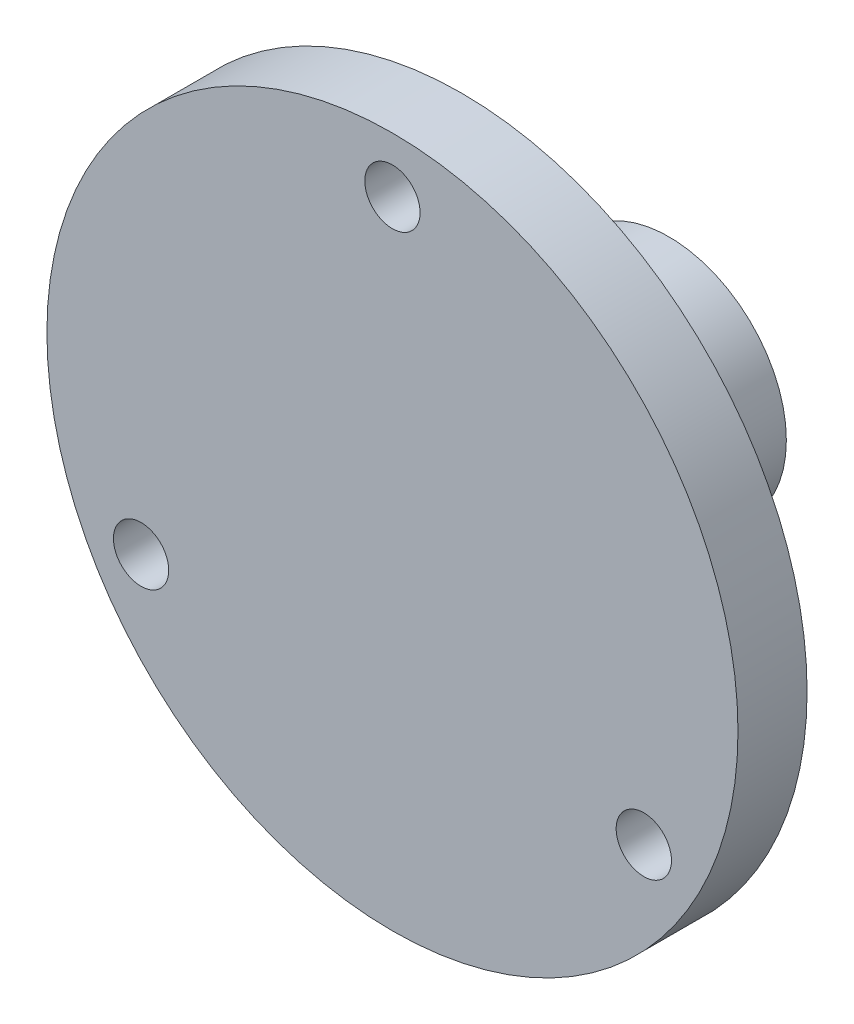
ISO-10303-21;
HEADER;
FILE_DESCRIPTION(('STEP AP214'),'2;1');
FILE_NAME('part.step','',(''),(''),'','','');
FILE_SCHEMA(('AUTOMOTIVE_DESIGN { 1 0 10303 214 1 1 1 1 }'));
ENDSEC;
DATA;
#1=APPLICATION_CONTEXT('core data for automotive mechanical design processes');
#2=APPLICATION_PROTOCOL_DEFINITION('international standard','automotive_design',2000,#1);
#3=PRODUCT_CONTEXT('',#1,'mechanical');
#4=PRODUCT('Part','Part','',(#3));
#5=PRODUCT_RELATED_PRODUCT_CATEGORY('part','',(#4));
#6=PRODUCT_DEFINITION_FORMATION('','',#4);
#7=PRODUCT_DEFINITION_CONTEXT('part definition',#1,'design');
#8=PRODUCT_DEFINITION('design','',#6,#7);
#9=PRODUCT_DEFINITION_SHAPE('','',#8);
#10=(LENGTH_UNIT() NAMED_UNIT(*) SI_UNIT(.MILLI.,.METRE.));
#11=(NAMED_UNIT(*) PLANE_ANGLE_UNIT() SI_UNIT($,.RADIAN.));
#12=(NAMED_UNIT(*) SI_UNIT($,.STERADIAN.) SOLID_ANGLE_UNIT());
#13=UNCERTAINTY_MEASURE_WITH_UNIT(LENGTH_MEASURE(1.E-05),#10,'distance_accuracy_value','');
#14=(GEOMETRIC_REPRESENTATION_CONTEXT(3) GLOBAL_UNCERTAINTY_ASSIGNED_CONTEXT((#13)) GLOBAL_UNIT_ASSIGNED_CONTEXT((#10,
#11,#12)) REPRESENTATION_CONTEXT('',''));
#15=CARTESIAN_POINT('',(0.,0.,0.));
#16=DIRECTION('',(0.,0.,1.));
#17=DIRECTION('',(1.,0.,0.));
#18=AXIS2_PLACEMENT_3D('',#15,#16,#17);
#19=CARTESIAN_POINT('',(0.,0.,0.));
#20=DIRECTION('',(0.,0.,1.));
#21=DIRECTION('',(1.,0.,0.));
#22=AXIS2_PLACEMENT_3D('',#19,#20,#21);
#23=CYLINDRICAL_SURFACE('',#22,12.7);
#24=CARTESIAN_POINT('',(0.,-12.7,-34.25));
#25=CARTESIAN_POINT('',(-0.231842485477689,-12.7000007830132,-34.2500012612385));
#26=CARTESIAN_POINT('',(-0.463676995619259,-12.6935930237934,-34.23096743451));
#27=CARTESIAN_POINT('',(-0.920514309419077,-12.6686626811236,-34.1555702559658));
#28=CARTESIAN_POINT('',(-1.14551645494716,-12.6501389344458,-34.0992033198781));
#29=CARTESIAN_POINT('',(-1.58203696952573,-12.6029886397923,-33.9512906027172));
#30=CARTESIAN_POINT('',(-1.79357729332375,-12.5743790665333,-33.8598039062806));
#31=CARTESIAN_POINT('',(-2.1983110147476,-12.5099751759744,-33.6445166990585));
#32=CARTESIAN_POINT('',(-2.39150073812595,-12.474179424271,-33.5207097354728));
#33=CARTESIAN_POINT('',(-2.76078654880293,-12.3977720837665,-33.2397626793203));
#34=CARTESIAN_POINT('',(-2.93615439481415,-12.3570444809732,-33.0816971002867));
#35=CARTESIAN_POINT('',(-3.25845012848092,-12.2759998868099,-32.7386873206566));
#36=CARTESIAN_POINT('',(-3.40537168699156,-12.2356829887054,-32.5537371543743));
#37=CARTESIAN_POINT('',(-3.67077525511996,-12.158745947934,-32.1556354026522));
#38=CARTESIAN_POINT('',(-3.78830816203193,-12.1222670474646,-31.9418211435214));
#39=CARTESIAN_POINT('',(-3.98543540896977,-12.0589014712391,-31.4960431529153));
#40=CARTESIAN_POINT('',(-4.06504143092195,-12.0320118425172,-31.2640850356218));
#41=CARTESIAN_POINT('',(-4.18131890368397,-11.9920915344925,-30.7968882173133));
#42=CARTESIAN_POINT('',(-4.21935573225782,-11.9786214962095,-30.5620279957362));
#43=CARTESIAN_POINT('',(-4.25568347252199,-11.9657663735035,-30.0889024928102));
#44=CARTESIAN_POINT('',(-4.25398678125709,-11.9663768958786,-29.8506382967039));
#45=CARTESIAN_POINT('',(-4.21195528947811,-11.9812290680516,-29.3891374770404));
#46=CARTESIAN_POINT('',(-4.17340554987952,-11.9948409413268,-29.1657144864736));
#47=CARTESIAN_POINT('',(-4.06167545132787,-12.0331311099076,-28.7287117420694));
#48=CARTESIAN_POINT('',(-3.98849091546046,-12.0578107399525,-28.5151331788681));
#49=CARTESIAN_POINT('',(-3.80840594130702,-12.1159022567189,-28.0998390301114));
#50=CARTESIAN_POINT('',(-3.70097860568121,-12.1494491053556,-27.8983716201879));
#51=CARTESIAN_POINT('',(-3.45582331327757,-12.2214389842504,-27.5157602710478));
#52=CARTESIAN_POINT('',(-3.31808654903209,-12.2598834363088,-27.3346222624024));
#53=CARTESIAN_POINT('',(-3.00766124206506,-12.3398112142789,-26.987785302604));
#54=CARTESIAN_POINT('',(-2.83351437105054,-12.381347971637,-26.8234012125245));
#55=CARTESIAN_POINT('',(-2.45961521549961,-12.4610105953748,-26.5258259616716));
#56=CARTESIAN_POINT('',(-2.25986043921874,-12.4991361292159,-26.3926378399522));
#57=CARTESIAN_POINT('',(-1.83761025749114,-12.5681879637238,-26.1601654270006));
#58=CARTESIAN_POINT('',(-1.6149061537069,-12.5990379205903,-26.0612359678836));
#59=CARTESIAN_POINT('',(-1.15473721743719,-12.649508090629,-25.9026533041889));
#60=CARTESIAN_POINT('',(-0.917277586558132,-12.6691322364961,-25.8429863438297));
#61=CARTESIAN_POINT('',(-0.445467513972475,-12.6942870000793,-25.7669577295333));
#62=CARTESIAN_POINT('',(-0.211433771574517,-12.7003953946827,-25.7488195308219));
#63=CARTESIAN_POINT('',(0.256381520779651,-12.6995648357979,-25.7512993107811));
#64=CARTESIAN_POINT('',(0.490163106899585,-12.6926281043092,-25.7719106891673));
#65=CARTESIAN_POINT('',(0.943710616119393,-12.6668680990626,-25.8499003074258));
#66=CARTESIAN_POINT('',(1.16368647866887,-12.6483983000775,-25.906185919068));
#67=CARTESIAN_POINT('',(1.59098248280005,-12.6017858364619,-26.0525580274301));
#68=CARTESIAN_POINT('',(1.79830100416235,-12.5736419365299,-26.1426488409251));
#69=CARTESIAN_POINT('',(2.2005032030246,-12.5096113397672,-26.3567111434203));
#70=CARTESIAN_POINT('',(2.39491369659754,-12.4735397382247,-26.4815148048116));
#71=CARTESIAN_POINT('',(2.76060901281045,-12.3977405993665,-26.7604835961703));
#72=CARTESIAN_POINT('',(2.9318866957179,-12.3580119396659,-26.914657755846));
#73=CARTESIAN_POINT('',(3.25462225547432,-12.2770680388917,-27.2563443551907));
#74=CARTESIAN_POINT('',(3.4048125874238,-12.2358680802768,-27.4450605669338));
#75=CARTESIAN_POINT('',(3.67155276243923,-12.1584971182436,-27.8458998882039));
#76=CARTESIAN_POINT('',(3.78810226272241,-12.1223261660702,-28.0580232362071));
#77=CARTESIAN_POINT('',(3.98372707837644,-12.0594576491274,-28.4997871990218));
#78=CARTESIAN_POINT('',(4.06287286907747,-12.0327422923622,-28.7293939160983));
#79=CARTESIAN_POINT('',(4.18101409065173,-11.99220989748,-29.1997782668773));
#80=CARTESIAN_POINT('',(4.22002779834845,-11.9783869881942,-29.4405507632381));
#81=CARTESIAN_POINT('',(4.2553652030169,-11.965875716158,-29.9130209174441));
#82=CARTESIAN_POINT('',(4.25379442249757,-11.9664408771634,-30.1445430681297));
#83=CARTESIAN_POINT('',(4.21319571568979,-11.9807944121373,-30.6038405238481));
#84=CARTESIAN_POINT('',(4.1741700524378,-11.9945819872031,-30.8316160544071));
#85=CARTESIAN_POINT('',(4.06126464747471,-12.0332689163471,-31.2725782638138));
#86=CARTESIAN_POINT('',(3.98807198081187,-12.0579487238983,-31.4859616402185));
#87=CARTESIAN_POINT('',(3.8094682451443,-12.1155567404975,-31.897581833261));
#88=CARTESIAN_POINT('',(3.70404998927837,-12.1484867891955,-32.0958152588593));
#89=CARTESIAN_POINT('',(3.45858592105688,-12.2206878565681,-32.4809459433433));
#90=CARTESIAN_POINT('',(3.31722264117411,-12.260173846087,-32.6669629621793));
#91=CARTESIAN_POINT('',(3.00610284853705,-12.3401423049604,-33.0133147391809));
#92=CARTESIAN_POINT('',(2.83633827843291,-12.3806250543048,-33.1736421839602));
#93=CARTESIAN_POINT('',(2.46520423896725,-12.4599404755415,-33.4704325719266));
#94=CARTESIAN_POINT('',(2.26285309599365,-12.498645296872,-33.6057064152756));
#95=CARTESIAN_POINT('',(1.83700682078668,-12.5682880759689,-33.8401749080672));
#96=CARTESIAN_POINT('',(1.61351691548857,-12.5992279468806,-33.9393784472981));
#97=CARTESIAN_POINT('',(1.16139505097975,-12.648741489848,-34.0949211206583));
#98=CARTESIAN_POINT('',(0.93337515749296,-12.6677807245626,-34.1528882525832));
#99=CARTESIAN_POINT('',(0.470232762281187,-12.6934078289513,-34.2304216443052));
#100=CARTESIAN_POINT('',(0.235112280199051,-12.6999992059435,-34.2499987209736));
#101=CARTESIAN_POINT('',(0.,-12.7,-34.25));
#102=B_SPLINE_CURVE_WITH_KNOTS('',3,(#24,#25,#26,#27,#28,#29,#30,#31,#32,#33,#34,#35,#36,#37,
#38,#39,#40,#41,#42,#43,#44,#45,#46,#47,#48,#49,#50,#51,#52,#53,#54,#55,#56,#57,#58,#59,#60,#61,
#62,#63,#64,#65,#66,#67,#68,#69,#70,#71,#72,#73,#74,#75,#76,#77,#78,#79,#80,#81,#82,#83,#84,#85,
#86,#87,#88,#89,#90,#91,#92,#93,#94,#95,#96,#97,#98,#99,#100,#101),.UNSPECIFIED.,.T.,.F.,(4,2,2,
2,2,2,2,2,2,2,2,2,2,2,2,2,2,2,2,2,2,2,2,2,2,2,2,2,2,2,2,2,2,2,2,2,2,2,4),(0.,0.69466219644897,
1.38939109559831,2.08295628599035,2.77666005397789,3.49217041485631,4.20783979043205,
4.94427896532909,5.68049116142398,6.39171869942388,7.10272433404949,7.78094824233089,
8.45925396444277,9.14854621093634,9.83803902059198,10.5638311505952,11.2896939565531,
12.0228645069128,12.7557780509269,13.4567008238895,14.1575042182453,14.8378171745532,
15.518217033405,16.2165914165274,16.9151808563973,17.6457758998408,18.3763783874091,
19.1055987451217,19.8344868564301,20.5256400044818,21.2167513954595,21.894527099023,
22.5724540686485,23.2801548831202,23.9880568114394,24.72384915567,25.4594600354206,
26.1641179874323,26.8685773648354),.UNSPECIFIED.);
#103=CARTESIAN_POINT('',(0.,-12.7,-34.25));
#104=VERTEX_POINT('',#103);
#105=EDGE_CURVE('E287',#104,#104,#102,.T.);
#106=ORIENTED_EDGE('',*,*,#105,.F.);
#107=EDGE_LOOP('',(#106));
#108=FACE_BOUND('',#107,.T.);
#109=CARTESIAN_POINT('',(0.,12.7,-25.75));
#110=CARTESIAN_POINT('',(0.231842485477689,12.7000007830132,-25.7499987387615));
#111=CARTESIAN_POINT('',(0.463676995619259,12.6935930237934,-25.76903256549));
#112=CARTESIAN_POINT('',(0.920514309419077,12.6686626811236,-25.8444297440342));
#113=CARTESIAN_POINT('',(1.14551645494715,12.6501389344458,-25.9007966801219));
#114=CARTESIAN_POINT('',(1.58203696952573,12.6029886397923,-26.0487093972829));
#115=CARTESIAN_POINT('',(1.79357729332375,12.5743790665333,-26.1401960937194));
#116=CARTESIAN_POINT('',(2.19831101474759,12.5099751759744,-26.3554833009415));
#117=CARTESIAN_POINT('',(2.39150073812595,12.474179424271,-26.4792902645272));
#118=CARTESIAN_POINT('',(2.76078654880293,12.3977720837665,-26.7602373206797));
#119=CARTESIAN_POINT('',(2.93615439481415,12.3570444809732,-26.9183028997133));
#120=CARTESIAN_POINT('',(3.25845012848092,12.2759998868099,-27.2613126793434));
#121=CARTESIAN_POINT('',(3.40537168699155,12.2356829887054,-27.4462628456257));
#122=CARTESIAN_POINT('',(3.67077525511996,12.158745947934,-27.8443645973478));
#123=CARTESIAN_POINT('',(3.78830816203193,12.1222670474646,-28.0581788564786));
#124=CARTESIAN_POINT('',(3.98543540896977,12.0589014712391,-28.5039568470847));
#125=CARTESIAN_POINT('',(4.06504143092194,12.0320118425172,-28.7359149643782));
#126=CARTESIAN_POINT('',(4.18131890368397,11.9920915344925,-29.2031117826867));
#127=CARTESIAN_POINT('',(4.21935573225782,11.9786214962095,-29.4379720042638));
#128=CARTESIAN_POINT('',(4.25568347252199,11.9657663735035,-29.9110975071898));
#129=CARTESIAN_POINT('',(4.25398678125709,11.9663768958786,-30.1493617032961));
#130=CARTESIAN_POINT('',(4.21195528947811,11.9812290680516,-30.6108625229596));
#131=CARTESIAN_POINT('',(4.17340554987952,11.9948409413268,-30.8342855135263));
#132=CARTESIAN_POINT('',(4.06167545132787,12.0331311099076,-31.2712882579306));
#133=CARTESIAN_POINT('',(3.98849091546046,12.0578107399525,-31.4848668211319));
#134=CARTESIAN_POINT('',(3.80840594130702,12.1159022567189,-31.9001609698886));
#135=CARTESIAN_POINT('',(3.70097860568121,12.1494491053557,-32.1016283798121));
#136=CARTESIAN_POINT('',(3.45582331327757,12.2214389842504,-32.4842397289522));
#137=CARTESIAN_POINT('',(3.31808654903209,12.2598834363088,-32.6653777375976));
#138=CARTESIAN_POINT('',(3.00766124206506,12.3398112142789,-33.012214697396));
#139=CARTESIAN_POINT('',(2.83351437105054,12.381347971637,-33.1765987874755));
#140=CARTESIAN_POINT('',(2.45961521549961,12.4610105953748,-33.4741740383284));
#141=CARTESIAN_POINT('',(2.25986043921874,12.4991361292159,-33.6073621600478));
#142=CARTESIAN_POINT('',(1.83761025749114,12.5681879637238,-33.8398345729994));
#143=CARTESIAN_POINT('',(1.6149061537069,12.5990379205903,-33.9387640321164));
#144=CARTESIAN_POINT('',(1.15473721743719,12.649508090629,-34.0973466958111));
#145=CARTESIAN_POINT('',(0.917277586558134,12.6691322364961,-34.1570136561703));
#146=CARTESIAN_POINT('',(0.445467513972477,12.6942870000793,-34.2330422704666));
#147=CARTESIAN_POINT('',(0.211433771574518,12.7003953946827,-34.2511804691781));
#148=CARTESIAN_POINT('',(-0.256381520779649,12.6995648357979,-34.2487006892189));
#149=CARTESIAN_POINT('',(-0.490163106899583,12.6926281043092,-34.2280893108327));
#150=CARTESIAN_POINT('',(-0.943710616119391,12.6668680990626,-34.1500996925742));
#151=CARTESIAN_POINT('',(-1.16368647866886,12.6483983000775,-34.093814080932));
#152=CARTESIAN_POINT('',(-1.59098248280005,12.6017858364619,-33.9474419725699));
#153=CARTESIAN_POINT('',(-1.79830100416234,12.5736419365299,-33.8573511590749));
#154=CARTESIAN_POINT('',(-2.2005032030246,12.5096113397672,-33.6432888565797));
#155=CARTESIAN_POINT('',(-2.39491369659754,12.4735397382247,-33.5184851951884));
#156=CARTESIAN_POINT('',(-2.76060901281045,12.3977405993665,-33.2395164038297));
#157=CARTESIAN_POINT('',(-2.9318866957179,12.3580119396659,-33.085342244154));
#158=CARTESIAN_POINT('',(-3.25462225547432,12.2770680388917,-32.7436556448093));
#159=CARTESIAN_POINT('',(-3.4048125874238,12.2358680802768,-32.5549394330662));
#160=CARTESIAN_POINT('',(-3.67155276243922,12.1584971182436,-32.1541001117961));
#161=CARTESIAN_POINT('',(-3.7881022627224,12.1223261660702,-31.9419767637929));
#162=CARTESIAN_POINT('',(-3.98372707837644,12.0594576491274,-31.5002128009782));
#163=CARTESIAN_POINT('',(-4.06287286907747,12.0327422923622,-31.2706060839018));
#164=CARTESIAN_POINT('',(-4.18101409065172,11.99220989748,-30.8002217331227));
#165=CARTESIAN_POINT('',(-4.22002779834845,11.9783869881942,-30.5594492367619));
#166=CARTESIAN_POINT('',(-4.2553652030169,11.965875716158,-30.0869790825559));
#167=CARTESIAN_POINT('',(-4.25379442249757,11.9664408771634,-29.8554569318703));
#168=CARTESIAN_POINT('',(-4.21319571568979,11.9807944121373,-29.3961594761519));
#169=CARTESIAN_POINT('',(-4.1741700524378,11.9945819872031,-29.1683839455929));
#170=CARTESIAN_POINT('',(-4.0612646474747,12.0332689163471,-28.7274217361862));
#171=CARTESIAN_POINT('',(-3.98807198081187,12.0579487238983,-28.5140383597815));
#172=CARTESIAN_POINT('',(-3.8094682451443,12.1155567404975,-28.102418166739));
#173=CARTESIAN_POINT('',(-3.70404998927837,12.1484867891955,-27.9041847411407));
#174=CARTESIAN_POINT('',(-3.45858592105688,12.2206878565681,-27.5190540566567));
#175=CARTESIAN_POINT('',(-3.31722264117411,12.260173846087,-27.3330370378207));
#176=CARTESIAN_POINT('',(-3.00610284853705,12.3401423049603,-26.9866852608191));
#177=CARTESIAN_POINT('',(-2.83633827843291,12.3806250543048,-26.8263578160398));
#178=CARTESIAN_POINT('',(-2.46520423896725,12.4599404755415,-26.5295674280735));
#179=CARTESIAN_POINT('',(-2.26285309599365,12.4986452968721,-26.3942935847244));
#180=CARTESIAN_POINT('',(-1.83700682078667,12.5682880759689,-26.1598250919328));
#181=CARTESIAN_POINT('',(-1.61351691548857,12.5992279468806,-26.0606215527019));
#182=CARTESIAN_POINT('',(-1.16139505097975,12.648741489848,-25.9050788793417));
#183=CARTESIAN_POINT('',(-0.933375157492959,12.6677807245626,-25.8471117474168));
#184=CARTESIAN_POINT('',(-0.470232762281187,12.6934078289513,-25.7695783556948));
#185=CARTESIAN_POINT('',(-0.235112280199051,12.6999992059435,-25.7500012790264));
#186=CARTESIAN_POINT('',(0.,12.7,-25.75));
#187=B_SPLINE_CURVE_WITH_KNOTS('',3,(#109,#110,#111,#112,#113,#114,#115,#116,#117,#118,#119,
#120,#121,#122,#123,#124,#125,#126,#127,#128,#129,#130,#131,#132,#133,#134,#135,#136,#137,#138,
#139,#140,#141,#142,#143,#144,#145,#146,#147,#148,#149,#150,#151,#152,#153,#154,#155,#156,#157,
#158,#159,#160,#161,#162,#163,#164,#165,#166,#167,#168,#169,#170,#171,#172,#173,#174,#175,#176,
#177,#178,#179,#180,#181,#182,#183,#184,#185,#186),.UNSPECIFIED.,.T.,.F.,(4,2,2,2,2,2,2,2,2,2,2,
2,2,2,2,2,2,2,2,2,2,2,2,2,2,2,2,2,2,2,2,2,2,2,2,2,2,2,4),(0.,0.69466219644897,1.38939109559831,
2.08295628599035,2.77666005397788,3.49217041485631,4.20783979043204,4.94427896532908,
5.68049116142398,6.39171869942387,7.10272433404949,7.78094824233088,8.45925396444277,
9.14854621093634,9.83803902059197,10.5638311505952,11.2896939565531,12.0228645069127,
12.7557780509269,13.4567008238895,14.1575042182452,14.8378171745532,15.518217033405,
16.2165914165274,16.9151808563973,17.6457758998408,18.3763783874091,19.1055987451217,
19.8344868564301,20.5256400044818,21.2167513954595,21.894527099023,22.5724540686484,
23.2801548831202,23.9880568114394,24.72384915567,25.4594600354206,26.1641179874323,
26.8685773648354),.UNSPECIFIED.);
#188=CARTESIAN_POINT('',(0.,12.7,-25.75));
#189=VERTEX_POINT('',#188);
#190=EDGE_CURVE('E82',#189,#189,#187,.T.);
#191=ORIENTED_EDGE('',*,*,#190,.T.);
#192=EDGE_LOOP('',(#191));
#193=FACE_BOUND('',#192,.T.);
#194=CARTESIAN_POINT('',(0.,0.,-40.));
#195=DIRECTION('',(0.,0.,1.));
#196=DIRECTION('',(1.,0.,0.));
#197=AXIS2_PLACEMENT_3D('',#194,#195,#196);
#198=CIRCLE('',#197,12.7);
#199=CARTESIAN_POINT('',(12.7,0.,-40.));
#200=VERTEX_POINT('',#199);
#201=EDGE_CURVE('E50',#200,#200,#198,.T.);
#202=ORIENTED_EDGE('',*,*,#201,.F.);
#203=EDGE_LOOP('',(#202));
#204=FACE_BOUND('',#203,.T.);
#205=CARTESIAN_POINT('',(0.,0.,-20.));
#206=DIRECTION('',(0.,0.,1.));
#207=DIRECTION('',(1.,0.,0.));
#208=AXIS2_PLACEMENT_3D('',#205,#206,#207);
#209=CIRCLE('',#208,12.7);
#210=CARTESIAN_POINT('',(12.7,0.,-20.));
#211=VERTEX_POINT('',#210);
#212=EDGE_CURVE('E99',#211,#211,#209,.T.);
#213=ORIENTED_EDGE('',*,*,#212,.T.);
#214=EDGE_LOOP('',(#213));
#215=FACE_BOUND('',#214,.T.);
#216=ADVANCED_FACE('F35',(#108,#193,#204,#215),#23,.F.);
#217=CARTESIAN_POINT('',(0.,17.,-40.));
#218=DIRECTION('',(0.,0.,1.));
#219=DIRECTION('',(1.,0.,0.));
#220=AXIS2_PLACEMENT_3D('',#217,#218,#219);
#221=PLANE('',#220);
#222=CARTESIAN_POINT('',(0.,0.,-40.));
#223=DIRECTION('',(0.,0.,1.));
#224=DIRECTION('',(1.,0.,0.));
#225=AXIS2_PLACEMENT_3D('',#222,#223,#224);
#226=CIRCLE('',#225,17.);
#227=CARTESIAN_POINT('',(17.,0.,-40.));
#228=VERTEX_POINT('',#227);
#229=EDGE_CURVE('E54',#228,#228,#226,.T.);
#230=ORIENTED_EDGE('',*,*,#229,.F.);
#231=EDGE_LOOP('',(#230));
#232=FACE_BOUND('',#231,.T.);
#233=ORIENTED_EDGE('',*,*,#201,.T.);
#234=EDGE_LOOP('',(#233));
#235=FACE_BOUND('',#234,.T.);
#236=ADVANCED_FACE('F124',(#232,#235),#221,.F.);
#237=CARTESIAN_POINT('',(0.,0.,0.));
#238=DIRECTION('',(0.,0.,1.));
#239=DIRECTION('',(1.,0.,0.));
#240=AXIS2_PLACEMENT_3D('',#237,#238,#239);
#241=CYLINDRICAL_SURFACE('',#240,17.);
#242=CARTESIAN_POINT('',(-3.27361521331593,-16.6818297407233,-33.3819653485074));
#243=CARTESIAN_POINT('',(-3.45424515670908,-16.6463856388575,-33.1577761453749));
#244=CARTESIAN_POINT('',(-3.61529982943289,-16.6117477568102,-32.9173914968345));
#245=CARTESIAN_POINT('',(-3.89577563186445,-16.5482242845638,-32.4124613246661));
#246=CARTESIAN_POINT('',(-4.01511916319783,-16.5193494581494,-32.1478719122983));
#247=CARTESIAN_POINT('',(-4.21076205806757,-16.4705714056275,-31.6011343855303));
#248=CARTESIAN_POINT('',(-4.28687180407884,-16.4507077768683,-31.3189148569379));
#249=CARTESIAN_POINT('',(-4.39409913783549,-16.4223928298015,-30.745659661486));
#250=CARTESIAN_POINT('',(-4.42523542296754,-16.4139367689779,-30.454627709735));
#251=CARTESIAN_POINT('',(-4.44246539399084,-16.4092849869825,-29.8585809934337));
#252=CARTESIAN_POINT('',(-4.42656799878592,-16.4136311916488,-29.5535023185141));
#253=CARTESIAN_POINT('',(-4.34562804421359,-16.4352436225869,-28.9503193600313));
#254=CARTESIAN_POINT('',(-4.28057164209882,-16.4525134880357,-28.6522170653368));
#255=CARTESIAN_POINT('',(-4.10209152539875,-16.497918346404,-28.0707824357088));
#256=CARTESIAN_POINT('',(-3.98853490621438,-16.5260831745208,-27.7874931046813));
#257=CARTESIAN_POINT('',(-3.71465855288783,-16.5897862919048,-27.2452165262402));
#258=CARTESIAN_POINT('',(-3.55433212535928,-16.6253256363539,-26.986232764296));
#259=CARTESIAN_POINT('',(-3.1948472143184,-16.6980687507052,-26.5092164808346));
#260=CARTESIAN_POINT('',(-2.9970035171134,-16.7351901687246,-26.290185611107));
#261=CARTESIAN_POINT('',(-2.56309114611482,-16.8071017584507,-25.8933310356796));
#262=CARTESIAN_POINT('',(-2.32705414646122,-16.841893828398,-25.7154734790396));
#263=CARTESIAN_POINT('',(-1.84930715552841,-16.9006420543721,-25.4271736445768));
#264=CARTESIAN_POINT('',(-1.61079118552331,-16.9253521461019,-25.3116157938424));
#265=CARTESIAN_POINT('',(-1.11518971580867,-16.9651926869773,-25.1289145413224));
#266=CARTESIAN_POINT('',(-0.858130127932396,-16.9803362256842,-25.0617049688161));
#267=CARTESIAN_POINT('',(-0.37213341367953,-16.9974175136064,-24.9862277557885));
#268=CARTESIAN_POINT('',(-0.144313477046666,-17.0009105152486,-24.9710109842641));
#269=CARTESIAN_POINT('',(0.310387414733713,-16.9986838868057,-24.980766927575));
#270=CARTESIAN_POINT('',(0.537268652214914,-16.9929672647661,-25.0057265200118));
#271=CARTESIAN_POINT('',(0.969166714411751,-16.9736460903541,-25.0915778100138));
#272=CARTESIAN_POINT('',(1.1746713782833,-16.9605464049786,-25.150173734802));
#273=CARTESIAN_POINT('',(1.57350937399138,-16.928205454198,-25.2985807403268));
#274=CARTESIAN_POINT('',(1.76684080175568,-16.9089632308529,-25.388396690077));
#275=CARTESIAN_POINT('',(2.14812867894102,-16.8648895736323,-25.6015397705134));
#276=CARTESIAN_POINT('',(2.33514247961429,-16.8398010681658,-25.7264921151662));
#277=CARTESIAN_POINT('',(2.68822121831947,-16.7870604746278,-26.0026272471636));
#278=CARTESIAN_POINT('',(2.85427688602294,-16.7594072614361,-26.1538215722772));
#279=CARTESIAN_POINT('',(3.18270908541578,-16.7003475738776,-26.4983215608598));
#280=CARTESIAN_POINT('',(3.3420350775809,-16.6689037456891,-26.6945283499281));
#281=CARTESIAN_POINT('',(3.62968252062306,-16.6086435462679,-27.1088360886797));
#282=CARTESIAN_POINT('',(3.75798829875736,-16.5798285077711,-27.3269480273451));
#283=CARTESIAN_POINT('',(3.99565017625497,-16.5242693768213,-27.8068951020232));
#284=CARTESIAN_POINT('',(4.10091229720172,-16.4981837524708,-28.0708409318554));
#285=CARTESIAN_POINT('',(4.26949883488415,-16.4553626045415,-28.6125245526601));
#286=CARTESIAN_POINT('',(4.33281105988943,-16.438629799356,-28.8902663279048));
#287=CARTESIAN_POINT('',(4.41916573033342,-16.4156380952927,-29.4698608826249));
#288=CARTESIAN_POINT('',(4.43950402748566,-16.4100835245962,-29.772148473907));
#289=CARTESIAN_POINT('',(4.43156865210878,-16.4122270203369,-30.3760538503075));
#290=CARTESIAN_POINT('',(4.40328863399599,-16.4199268167127,-30.6776715428471));
#291=CARTESIAN_POINT('',(4.29792611030869,-16.4478212362834,-31.2755581805742));
#292=CARTESIAN_POINT('',(4.22024375320951,-16.4681693681561,-31.5717146780705));
#293=CARTESIAN_POINT('',(4.01670973870633,-16.5189886963301,-32.1461910588415));
#294=CARTESIAN_POINT('',(3.89084834202122,-16.5494619392347,-32.4245073224655));
#295=CARTESIAN_POINT('',(3.59481410747006,-16.6162562554145,-32.9508377836111));
#296=CARTESIAN_POINT('',(3.42525976581041,-16.6524931992147,-33.199209070805));
#297=CARTESIAN_POINT('',(3.0435908626901,-16.7264518359978,-33.6607454536144));
#298=CARTESIAN_POINT('',(2.83148945792657,-16.7641730671076,-33.8739213955198));
#299=CARTESIAN_POINT('',(2.38624889069173,-16.8330816203755,-34.2405851265246));
#300=CARTESIAN_POINT('',(2.15585661417556,-16.8645463973074,-34.3973377530233));
#301=CARTESIAN_POINT('',(1.66815290966798,-16.9197243862393,-34.6630062627042));
#302=CARTESIAN_POINT('',(1.41088099242804,-16.9434487700717,-34.7719911685688));
#303=CARTESIAN_POINT('',(0.915839780950349,-16.9768656775972,-34.9231117424344));
#304=CARTESIAN_POINT('',(0.680368167260679,-16.9880556223017,-34.9724601617445));
#305=CARTESIAN_POINT('',(0.204151600893952,-17.0004369165186,-35.0269876929835));
#306=CARTESIAN_POINT('',(-0.0365893331505099,-17.0016356365205,-35.0321993644732));
#307=CARTESIAN_POINT('',(-0.490201134685676,-16.9942913171326,-34.9999349603376));
#308=CARTESIAN_POINT('',(-0.703410203239341,-16.9867294107404,-34.9667585717315));
#309=CARTESIAN_POINT('',(-1.12125631307373,-16.9642734037876,-34.866381791226));
#310=CARTESIAN_POINT('',(-1.32589156325056,-16.9493777793904,-34.7991743280971));
#311=CARTESIAN_POINT('',(-1.72485586285969,-16.9134772837977,-34.6325619341514));
#312=CARTESIAN_POINT('',(-1.91896309656279,-16.8923769700726,-34.5326510044557));
#313=CARTESIAN_POINT('',(-2.28942227739166,-16.84616912408,-34.3050595132082));
#314=CARTESIAN_POINT('',(-2.46578196082821,-16.8210633502745,-34.1773911287482));
#315=CARTESIAN_POINT('',(-2.74941304473098,-16.776617370256,-33.9394714683443));
#316=CARTESIAN_POINT('',(-2.86177200443256,-16.757747072841,-33.8351022903775));
#317=CARTESIAN_POINT('',(-3.0758072694621,-16.7197849806031,-33.6160063114654));
#318=CARTESIAN_POINT('',(-3.17748348740223,-16.7006931839698,-33.5012794258055));
#319=CARTESIAN_POINT('',(-3.27361521331593,-16.6818297407233,-33.3819653485074));
#320=B_SPLINE_CURVE_WITH_KNOTS('',3,(#242,#243,#244,#245,#246,#247,#248,#249,#250,#251,#252,
#253,#254,#255,#256,#257,#258,#259,#260,#261,#262,#263,#264,#265,#266,#267,#268,#269,#270,#271,
#272,#273,#274,#275,#276,#277,#278,#279,#280,#281,#282,#283,#284,#285,#286,#287,#288,#289,#290,
#291,#292,#293,#294,#295,#296,#297,#298,#299,#300,#301,#302,#303,#304,#305,#306,#307,#308,#309,
#310,#311,#312,#313,#314,#315,#316,#317,#318,#319),.UNSPECIFIED.,.T.,.F.,(4,2,2,2,2,2,2,2,2,2,2,
2,2,2,2,2,2,2,2,2,2,2,2,2,2,2,2,2,2,2,2,2,2,2,2,2,2,2,4),(0.,0.869655525326563,1.74092043048219,
2.61597765271419,3.49067097150527,4.40291521556946,5.31541643542389,6.23043437939201,
7.14558333898819,8.03317340330766,8.92003111656327,9.71383221655853,10.5065448218436,
11.1879896651553,11.8692119802055,12.5086868226607,13.1482614411323,13.8244813468435,
14.50099932171,15.2620225610422,16.023429502176,16.8757824135366,17.7283829322864,
18.6332070883353,19.5381493495319,20.4542950038029,21.3706259526762,22.2746372706741,
23.1783694737742,24.0147331671827,24.8498843278083,25.5683448620608,26.2862753436908,
26.9309810721491,27.5758208173612,28.2311507464363,28.8861937627289,29.3490229105698,
29.8118558441885),.UNSPECIFIED.);
#321=CARTESIAN_POINT('',(-3.27361521331593,-16.6818297407233,-33.3819653485074));
#322=VERTEX_POINT('',#321);
#323=EDGE_CURVE('E10',#322,#322,#320,.T.);
#324=ORIENTED_EDGE('',*,*,#323,.T.);
#325=EDGE_LOOP('',(#324));
#326=FACE_BOUND('',#325,.T.);
#327=CARTESIAN_POINT('',(-3.27361521331593,16.6818297407233,-33.3819653485074));
#328=CARTESIAN_POINT('',(-3.12845486301491,16.710313391676,-33.5621265771487));
#329=CARTESIAN_POINT('',(-2.97059100018444,16.7393314197127,-33.7319137662812));
#330=CARTESIAN_POINT('',(-2.6311041520007,16.7960381401449,-34.0462814626877));
#331=CARTESIAN_POINT('',(-2.44947853779451,16.8237266849905,-34.190859176807));
#332=CARTESIAN_POINT('',(-2.03843582708211,16.878785294209,-34.4677271919683));
#333=CARTESIAN_POINT('',(-1.80588346518677,16.9055805438776,-34.5955451346894));
#334=CARTESIAN_POINT('',(-1.31979930640909,16.9504397126239,-34.8044200097857));
#335=CARTESIAN_POINT('',(-1.06628281253929,16.9685099358784,-34.8855107126603));
#336=CARTESIAN_POINT('',(-0.580675145819844,16.9915930526183,-34.9882327828639));
#337=CARTESIAN_POINT('',(-0.349965767490195,16.9979754932527,-35.0161200618545));
#338=CARTESIAN_POINT('',(0.112733304454294,17.0011968624759,-35.0302517144778));
#339=CARTESIAN_POINT('',(0.344722242978681,16.9980409205284,-35.0165184704015));
#340=CARTESIAN_POINT('',(0.784634054605731,16.9832015506845,-34.9509628436913));
#341=CARTESIAN_POINT('',(0.993038304211968,16.9721905320576,-34.9021417303206));
#342=CARTESIAN_POINT('',(1.39901860784915,16.9435589620387,-34.7722691929128));
#343=CARTESIAN_POINT('',(1.59659328719174,16.9259375737536,-34.6912136878246));
#344=CARTESIAN_POINT('',(1.98467376801023,16.8849274673775,-34.4963466772373));
#345=CARTESIAN_POINT('',(2.17453521344582,16.8613277974381,-34.3813035628769));
#346=CARTESIAN_POINT('',(2.53462550424859,16.8109724713548,-34.1243961667553));
#347=CARTESIAN_POINT('',(2.70484634593218,16.7842155375246,-33.982521012467));
#348=CARTESIAN_POINT('',(3.04247828509941,16.7265087194973,-33.657923268082));
#349=CARTESIAN_POINT('',(3.20712166058278,16.6954399322481,-33.4723452368972));
#350=CARTESIAN_POINT('',(3.50698775200308,16.6350376346747,-33.0785397603077));
#351=CARTESIAN_POINT('',(3.64219530941564,16.6057050240615,-32.8703007275923));
#352=CARTESIAN_POINT('',(3.89672235855902,16.5479519516983,-32.4091830019063));
#353=CARTESIAN_POINT('',(4.01196331152979,16.5201004985019,-32.1539751174596));
#354=CARTESIAN_POINT('',(4.20199702343621,16.4727904877841,-31.6281847203314));
#355=CARTESIAN_POINT('',(4.27677638993374,16.45333470959,-31.3575971498132));
#356=CARTESIAN_POINT('',(4.38870384222487,16.4238531263337,-30.7882163655192));
#357=CARTESIAN_POINT('',(4.42281596375676,16.4145916865233,-30.4887818862635));
#358=CARTESIAN_POINT('',(4.44292503026567,16.4091594187883,-29.8881734368169));
#359=CARTESIAN_POINT('',(4.42891547951428,16.4129903581448,-29.5869992372671));
#360=CARTESIAN_POINT('',(4.35235094055673,16.4334609033758,-28.9860349486173));
#361=CARTESIAN_POINT('',(4.28896687975314,16.4503192196194,-28.6863573348791));
#362=CARTESIAN_POINT('',(4.11363818033335,16.4950329295416,-28.1023207399636));
#363=CARTESIAN_POINT('',(4.00168411865269,16.5228904570827,-27.8179647433736));
#364=CARTESIAN_POINT('',(3.73206833633452,16.5858557491974,-27.2757422151449));
#365=CARTESIAN_POINT('',(3.57481584102941,16.6208978258012,-27.0176653505003));
#366=CARTESIAN_POINT('',(3.21648653072433,16.6939368903111,-26.5342076830992));
#367=CARTESIAN_POINT('',(3.01541608174457,16.7319334484648,-26.3088221387516));
#368=CARTESIAN_POINT('',(2.58705469684403,16.8033096418154,-25.9136748120887));
#369=CARTESIAN_POINT('',(2.36220312156274,16.8368293682594,-25.741308888311));
#370=CARTESIAN_POINT('',(1.88254308402542,16.8971613640322,-25.4434426791988));
#371=CARTESIAN_POINT('',(1.62777640600709,16.9239828291758,-25.3178780239816));
#372=CARTESIAN_POINT('',(1.13271701764782,16.9637870954307,-25.1353752614257));
#373=CARTESIAN_POINT('',(0.895105391949136,16.9781483156636,-25.0714661404933));
#374=CARTESIAN_POINT('',(0.411778985849571,16.9967255420746,-24.9892104758066));
#375=CARTESIAN_POINT('',(0.166071499329265,17.0009504400947,-24.9708239979682));
#376=CARTESIAN_POINT('',(-0.296021083723634,16.9988122336781,-24.9802151671348));
#377=CARTESIAN_POINT('',(-0.512532812090324,16.9936094449568,-25.0029333382502));
#378=CARTESIAN_POINT('',(-0.938489060583108,16.9754137310538,-25.0836736538965));
#379=CARTESIAN_POINT('',(-1.14793378107498,16.9624210269303,-25.1416947966184));
#380=CARTESIAN_POINT('',(-1.55400997301727,16.9300486352031,-25.290013664744));
#381=CARTESIAN_POINT('',(-1.75066307668017,16.9106800849979,-25.3802551304308));
#382=CARTESIAN_POINT('',(-2.12759727247317,16.8674059576967,-25.5892204136554));
#383=CARTESIAN_POINT('',(-2.3078733617452,16.843499001051,-25.7079528945762));
#384=CARTESIAN_POINT('',(-2.66609368465906,16.7907089938639,-25.9827765116024));
#385=CARTESIAN_POINT('',(-2.84205477634407,16.7615677189125,-26.1413971136304));
#386=CARTESIAN_POINT('',(-3.16843000129584,16.7029518920697,-26.4829567296768));
#387=CARTESIAN_POINT('',(-3.31883104581675,16.6734771776211,-26.6659081180016));
#388=CARTESIAN_POINT('',(-3.61045644982559,16.6129363305681,-27.0767339319797));
#389=CARTESIAN_POINT('',(-3.74788262155382,16.5821694329643,-27.3073527001738));
#390=CARTESIAN_POINT('',(-3.98635793368355,16.5264627201964,-27.7873373196542));
#391=CARTESIAN_POINT('',(-4.08739156968863,16.5015253902007,-28.0367111066243));
#392=CARTESIAN_POINT('',(-4.25968038318142,16.457941702095,-28.5724904209753));
#393=CARTESIAN_POINT('',(-4.32721163008243,16.4401142510348,-28.86016689927));
#394=CARTESIAN_POINT('',(-4.4162105764084,16.4164310366995,-29.4430369751101));
#395=CARTESIAN_POINT('',(-4.43767097383361,16.410577171185,-29.7382317567677));
#396=CARTESIAN_POINT('',(-4.43412160075554,16.4115388321156,-30.3381364452159));
#397=CARTESIAN_POINT('',(-4.40755000224543,16.4187801707626,-30.6428378522109));
#398=CARTESIAN_POINT('',(-4.30527972049651,16.4458908031427,-31.2434168542583));
#399=CARTESIAN_POINT('',(-4.22956569310275,16.4657640410001,-31.5392916631165));
#400=CARTESIAN_POINT('',(-4.03207680834078,16.5152194016985,-32.1081669934118));
#401=CARTESIAN_POINT('',(-3.91118802198562,16.5446133915163,-32.3814913782046));
#402=CARTESIAN_POINT('',(-3.62500376985046,16.6096595392675,-32.9028679658204));
#403=CARTESIAN_POINT('',(-3.45975355473276,16.6453053073306,-33.1509455678486));
#404=CARTESIAN_POINT('',(-3.27361521331593,16.6818297407233,-33.3819653485074));
#405=B_SPLINE_CURVE_WITH_KNOTS('',3,(#327,#328,#329,#330,#331,#332,#333,#334,#335,#336,#337,
#338,#339,#340,#341,#342,#343,#344,#345,#346,#347,#348,#349,#350,#351,#352,#353,#354,#355,#356,
#357,#358,#359,#360,#361,#362,#363,#364,#365,#366,#367,#368,#369,#370,#371,#372,#373,#374,#375,
#376,#377,#378,#379,#380,#381,#382,#383,#384,#385,#386,#387,#388,#389,#390,#391,#392,#393,#394,
#395,#396,#397,#398,#399,#400,#401,#402,#403,#404),.UNSPECIFIED.,.T.,.F.,(4,2,2,2,2,2,2,2,2,2,2,
2,2,2,2,2,2,2,2,2,2,2,2,2,2,2,2,2,2,2,2,2,2,2,2,2,2,2,4),(0.,0.698602520151845,1.39728239481955,
2.19269239041243,2.98752680756721,3.68116167050419,4.37442358325178,5.01452884444876,
5.65471517230205,6.32176067908653,6.98907705866583,7.73615556329189,8.48361788466848,
9.3242104958866,10.1650811661152,11.0654301522326,11.9659006771915,12.8818262405739,
13.7979295821695,14.7060033393631,15.6139452563847,16.4648732826478,17.3146265961602,
18.0497892841603,18.7843068323977,19.4344641049958,20.0846029286381,20.7336120561219,
21.3828187811808,22.096047297954,22.8096399502192,23.6169334992106,24.4245705756871,
25.3086550806491,26.1928796982516,27.1063749796885,28.0201556267632,28.9168811524492,
29.8126954305288),.UNSPECIFIED.);
#406=CARTESIAN_POINT('',(-3.27361521331593,16.6818297407233,-33.3819653485074));
#407=VERTEX_POINT('',#406);
#408=EDGE_CURVE('E46',#407,#407,#405,.T.);
#409=ORIENTED_EDGE('',*,*,#408,.T.);
#410=EDGE_LOOP('',(#409));
#411=FACE_BOUND('',#410,.T.);
#412=CARTESIAN_POINT('',(0.,0.,-10.));
#413=DIRECTION('',(0.,0.,1.));
#414=DIRECTION('',(1.,0.,0.));
#415=AXIS2_PLACEMENT_3D('',#412,#413,#414);
#416=CIRCLE('',#415,17.);
#417=CARTESIAN_POINT('',(17.,0.,-10.));
#418=VERTEX_POINT('',#417);
#419=EDGE_CURVE('E118',#418,#418,#416,.T.);
#420=ORIENTED_EDGE('',*,*,#419,.F.);
#421=EDGE_LOOP('',(#420));
#422=FACE_BOUND('',#421,.T.);
#423=ORIENTED_EDGE('',*,*,#229,.T.);
#424=EDGE_LOOP('',(#423));
#425=FACE_BOUND('',#424,.T.);
#426=ADVANCED_FACE('F61',(#326,#411,#422,#425),#241,.T.);
#427=CARTESIAN_POINT('',(0.,50.,-10.));
#428=DIRECTION('',(0.,0.,1.));
#429=DIRECTION('',(1.,0.,0.));
#430=AXIS2_PLACEMENT_3D('',#427,#428,#429);
#431=PLANE('',#430);
#432=CARTESIAN_POINT('',(0.,42.,-10.));
#433=DIRECTION('',(0.,0.,1.));
#434=DIRECTION('',(1.,0.,0.));
#435=AXIS2_PLACEMENT_3D('',#432,#433,#434);
#436=CIRCLE('',#435,4.);
#437=CARTESIAN_POINT('',(4.,42.,-10.));
#438=VERTEX_POINT('',#437);
#439=EDGE_CURVE('E95',#438,#438,#436,.F.);
#440=ORIENTED_EDGE('',*,*,#439,.F.);
#441=EDGE_LOOP('',(#440));
#442=FACE_BOUND('',#441,.T.);
#443=CARTESIAN_POINT('',(36.3730669589491,-20.9999999999985,-10.));
#444=DIRECTION('',(0.,0.,1.));
#445=DIRECTION('',(1.,0.,0.));
#446=AXIS2_PLACEMENT_3D('',#443,#444,#445);
#447=CIRCLE('',#446,4.00000000000231);
#448=CARTESIAN_POINT('',(40.3730669589514,-20.9999999999985,-10.));
#449=VERTEX_POINT('',#448);
#450=EDGE_CURVE('E96',#449,#449,#447,.F.);
#451=ORIENTED_EDGE('',*,*,#450,.F.);
#452=EDGE_LOOP('',(#451));
#453=FACE_BOUND('',#452,.T.);
#454=CARTESIAN_POINT('',(-36.3730669589437,-21.0000000000016,-10.));
#455=DIRECTION('',(0.,0.,1.));
#456=DIRECTION('',(1.,0.,0.));
#457=AXIS2_PLACEMENT_3D('',#454,#455,#456);
#458=CIRCLE('',#457,4.0000000000034);
#459=CARTESIAN_POINT('',(-32.3730669589403,-21.0000000000016,-10.));
#460=VERTEX_POINT('',#459);
#461=EDGE_CURVE('E103',#460,#460,#458,.F.);
#462=ORIENTED_EDGE('',*,*,#461,.F.);
#463=EDGE_LOOP('',(#462));
#464=FACE_BOUND('',#463,.T.);
#465=CARTESIAN_POINT('',(0.,0.,-10.));
#466=DIRECTION('',(0.,0.,1.));
#467=DIRECTION('',(1.,0.,0.));
#468=AXIS2_PLACEMENT_3D('',#465,#466,#467);
#469=CIRCLE('',#468,50.);
#470=CARTESIAN_POINT('',(50.,0.,-10.));
#471=VERTEX_POINT('',#470);
#472=EDGE_CURVE('E115',#471,#471,#469,.T.);
#473=ORIENTED_EDGE('',*,*,#472,.F.);
#474=EDGE_LOOP('',(#473));
#475=FACE_BOUND('',#474,.T.);
#476=ORIENTED_EDGE('',*,*,#419,.T.);
#477=EDGE_LOOP('',(#476));
#478=FACE_BOUND('',#477,.T.);
#479=ADVANCED_FACE('F152',(#442,#453,#464,#475,#478),#431,.F.);
#480=CARTESIAN_POINT('',(0.,0.,0.));
#481=DIRECTION('',(0.,0.,1.));
#482=DIRECTION('',(1.,0.,0.));
#483=AXIS2_PLACEMENT_3D('',#480,#481,#482);
#484=CYLINDRICAL_SURFACE('',#483,50.);
#485=CARTESIAN_POINT('',(0.,0.,0.));
#486=DIRECTION('',(0.,0.,1.));
#487=DIRECTION('',(1.,0.,0.));
#488=AXIS2_PLACEMENT_3D('',#485,#486,#487);
#489=CIRCLE('',#488,50.);
#490=CARTESIAN_POINT('',(50.,0.,0.));
#491=VERTEX_POINT('',#490);
#492=EDGE_CURVE('E112',#491,#491,#489,.T.);
#493=ORIENTED_EDGE('',*,*,#492,.F.);
#494=EDGE_LOOP('',(#493));
#495=FACE_BOUND('',#494,.T.);
#496=ORIENTED_EDGE('',*,*,#472,.T.);
#497=EDGE_LOOP('',(#496));
#498=FACE_BOUND('',#497,.T.);
#499=ADVANCED_FACE('F146',(#495,#498),#484,.T.);
#500=CARTESIAN_POINT('',(0.,0.,0.));
#501=DIRECTION('',(0.,0.,-1.));
#502=DIRECTION('',(-1.,0.,0.));
#503=AXIS2_PLACEMENT_3D('',#500,#501,#502);
#504=PLANE('',#503);
#505=CARTESIAN_POINT('',(0.,42.,0.));
#506=DIRECTION('',(0.,0.,1.));
#507=DIRECTION('',(1.,0.,0.));
#508=AXIS2_PLACEMENT_3D('',#505,#506,#507);
#509=CIRCLE('',#508,4.);
#510=CARTESIAN_POINT('',(4.,42.,0.));
#511=VERTEX_POINT('',#510);
#512=EDGE_CURVE('E92',#511,#511,#509,.T.);
#513=ORIENTED_EDGE('',*,*,#512,.F.);
#514=EDGE_LOOP('',(#513));
#515=FACE_BOUND('',#514,.T.);
#516=CARTESIAN_POINT('',(36.3730669589491,-20.9999999999985,0.));
#517=DIRECTION('',(0.,0.,1.));
#518=DIRECTION('',(1.,0.,0.));
#519=AXIS2_PLACEMENT_3D('',#516,#517,#518);
#520=CIRCLE('',#519,4.00000000000231);
#521=CARTESIAN_POINT('',(40.3730669589514,-20.9999999999985,0.));
#522=VERTEX_POINT('',#521);
#523=EDGE_CURVE('E100',#522,#522,#520,.T.);
#524=ORIENTED_EDGE('',*,*,#523,.F.);
#525=EDGE_LOOP('',(#524));
#526=FACE_BOUND('',#525,.T.);
#527=CARTESIAN_POINT('',(-36.3730669589437,-21.0000000000016,0.));
#528=DIRECTION('',(0.,0.,1.));
#529=DIRECTION('',(1.,0.,0.));
#530=AXIS2_PLACEMENT_3D('',#527,#528,#529);
#531=CIRCLE('',#530,4.0000000000034);
#532=CARTESIAN_POINT('',(-32.3730669589403,-21.0000000000016,0.));
#533=VERTEX_POINT('',#532);
#534=EDGE_CURVE('E89',#533,#533,#531,.T.);
#535=ORIENTED_EDGE('',*,*,#534,.F.);
#536=EDGE_LOOP('',(#535));
#537=FACE_BOUND('',#536,.T.);
#538=ORIENTED_EDGE('',*,*,#492,.T.);
#539=EDGE_LOOP('',(#538));
#540=FACE_BOUND('',#539,.T.);
#541=ADVANCED_FACE('F137',(#515,#526,#537,#540),#504,.F.);
#542=CARTESIAN_POINT('',(0.,12.7,-20.));
#543=DIRECTION('',(0.,0.,1.));
#544=DIRECTION('',(1.,0.,0.));
#545=AXIS2_PLACEMENT_3D('',#542,#543,#544);
#546=PLANE('',#545);
#547=ORIENTED_EDGE('',*,*,#212,.F.);
#548=EDGE_LOOP('',(#547));
#549=FACE_BOUND('',#548,.T.);
#550=ADVANCED_FACE('F134',(#549),#546,.F.);
#551=CARTESIAN_POINT('',(-36.3730669589437,-21.0000000000016,-40.001));
#552=DIRECTION('',(0.,0.,1.));
#553=DIRECTION('',(1.,0.,0.));
#554=AXIS2_PLACEMENT_3D('',#551,#552,#553);
#555=CYLINDRICAL_SURFACE('',#554,4.0000000000034);
#556=ORIENTED_EDGE('',*,*,#534,.T.);
#557=EDGE_LOOP('',(#556));
#558=FACE_BOUND('',#557,.T.);
#559=ORIENTED_EDGE('',*,*,#461,.T.);
#560=EDGE_LOOP('',(#559));
#561=FACE_BOUND('',#560,.T.);
#562=ADVANCED_FACE('F136',(#558,#561),#555,.F.);
#563=CARTESIAN_POINT('',(36.3730669589491,-20.9999999999985,-40.001));
#564=DIRECTION('',(0.,0.,1.));
#565=DIRECTION('',(1.,0.,0.));
#566=AXIS2_PLACEMENT_3D('',#563,#564,#565);
#567=CYLINDRICAL_SURFACE('',#566,4.00000000000231);
#568=ORIENTED_EDGE('',*,*,#523,.T.);
#569=EDGE_LOOP('',(#568));
#570=FACE_BOUND('',#569,.T.);
#571=ORIENTED_EDGE('',*,*,#450,.T.);
#572=EDGE_LOOP('',(#571));
#573=FACE_BOUND('',#572,.T.);
#574=ADVANCED_FACE('F143',(#570,#573),#567,.F.);
#575=CARTESIAN_POINT('',(0.,42.,-40.001));
#576=DIRECTION('',(0.,0.,1.));
#577=DIRECTION('',(1.,0.,0.));
#578=AXIS2_PLACEMENT_3D('',#575,#576,#577);
#579=CYLINDRICAL_SURFACE('',#578,4.);
#580=ORIENTED_EDGE('',*,*,#512,.T.);
#581=EDGE_LOOP('',(#580));
#582=FACE_BOUND('',#581,.T.);
#583=ORIENTED_EDGE('',*,*,#439,.T.);
#584=EDGE_LOOP('',(#583));
#585=FACE_BOUND('',#584,.T.);
#586=ADVANCED_FACE('F70',(#582,#585),#579,.F.);
#587=CARTESIAN_POINT('',(0.,17.,-30.));
#588=DIRECTION('',(0.,1.,0.));
#589=DIRECTION('',(0.,0.,1.));
#590=AXIS2_PLACEMENT_3D('',#587,#588,#589);
#591=CONICAL_SURFACE('',#590,5.025,0.785398163397448);
#592=CARTESIAN_POINT('',(0.,16.225,-30.));
#593=DIRECTION('',(0.,1.,0.));
#594=DIRECTION('',(0.,0.,1.));
#595=AXIS2_PLACEMENT_3D('',#592,#593,#594);
#596=CIRCLE('',#595,4.25);
#597=CARTESIAN_POINT('',(0.,16.225,-25.75));
#598=VERTEX_POINT('',#597);
#599=EDGE_CURVE('E90',#598,#598,#596,.T.);
#600=ORIENTED_EDGE('',*,*,#599,.F.);
#601=EDGE_LOOP('',(#600));
#602=FACE_BOUND('',#601,.T.);
#603=ORIENTED_EDGE('',*,*,#408,.F.);
#604=EDGE_LOOP('',(#603));
#605=FACE_BOUND('',#604,.T.);
#606=ADVANCED_FACE('F64',(#602,#605),#591,.F.);
#607=CARTESIAN_POINT('',(0.,17.,-30.));
#608=DIRECTION('',(0.,1.,0.));
#609=DIRECTION('',(0.,0.,1.));
#610=AXIS2_PLACEMENT_3D('',#607,#608,#609);
#611=CYLINDRICAL_SURFACE('',#610,4.24999999999999);
#612=ORIENTED_EDGE('',*,*,#190,.F.);
#613=EDGE_LOOP('',(#612));
#614=FACE_BOUND('',#613,.T.);
#615=ORIENTED_EDGE('',*,*,#599,.T.);
#616=EDGE_LOOP('',(#615));
#617=FACE_BOUND('',#616,.T.);
#618=ADVANCED_FACE('F69',(#614,#617),#611,.F.);
#619=CARTESIAN_POINT('',(0.,-17.,-30.));
#620=DIRECTION('',(0.,-1.,0.));
#621=DIRECTION('',(0.,0.,-1.));
#622=AXIS2_PLACEMENT_3D('',#619,#620,#621);
#623=CONICAL_SURFACE('',#622,5.025,0.785398163397448);
#624=CARTESIAN_POINT('',(0.,-16.225,-30.));
#625=DIRECTION('',(0.,-1.,0.));
#626=DIRECTION('',(0.,0.,-1.));
#627=AXIS2_PLACEMENT_3D('',#624,#625,#626);
#628=CIRCLE('',#627,4.25);
#629=CARTESIAN_POINT('',(0.,-16.225,-34.25));
#630=VERTEX_POINT('',#629);
#631=EDGE_CURVE('E292',#630,#630,#628,.T.);
#632=ORIENTED_EDGE('',*,*,#631,.F.);
#633=EDGE_LOOP('',(#632));
#634=FACE_BOUND('',#633,.T.);
#635=ORIENTED_EDGE('',*,*,#323,.F.);
#636=EDGE_LOOP('',(#635));
#637=FACE_BOUND('',#636,.T.);
#638=ADVANCED_FACE('F77',(#634,#637),#623,.F.);
#639=CARTESIAN_POINT('',(0.,-17.,-30.));
#640=DIRECTION('',(0.,-1.,0.));
#641=DIRECTION('',(0.,0.,-1.));
#642=AXIS2_PLACEMENT_3D('',#639,#640,#641);
#643=CYLINDRICAL_SURFACE('',#642,4.25);
#644=ORIENTED_EDGE('',*,*,#105,.T.);
#645=EDGE_LOOP('',(#644));
#646=FACE_BOUND('',#645,.T.);
#647=ORIENTED_EDGE('',*,*,#631,.T.);
#648=EDGE_LOOP('',(#647));
#649=FACE_BOUND('',#648,.T.);
#650=ADVANCED_FACE('F202',(#646,#649),#643,.F.);
#651=CLOSED_SHELL('',(#216,#236,#426,#479,#499,#541,#550,#562,#574,#586,#606,#618,#638,#650));
#652=MANIFOLD_SOLID_BREP('B2',#651);
#653=ADVANCED_BREP_SHAPE_REPRESENTATION('',(#18,#652),#14);
#654=SHAPE_DEFINITION_REPRESENTATION(#9,#653);
ENDSEC;
END-ISO-10303-21;
